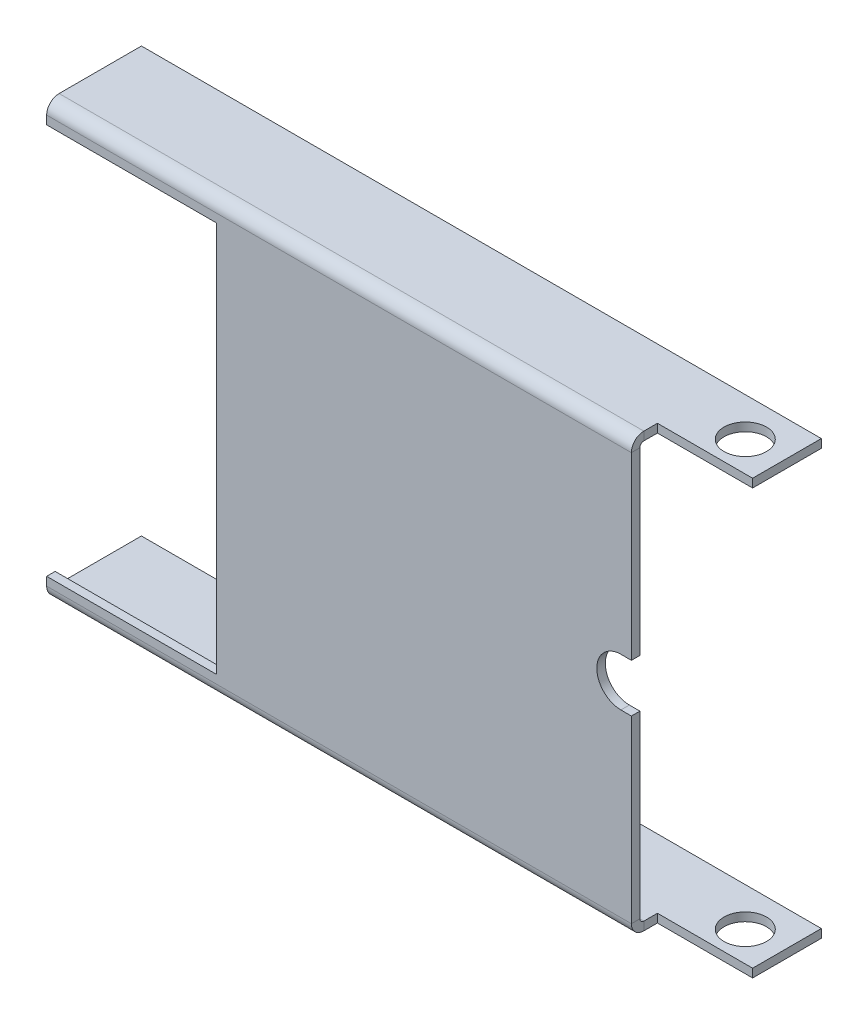
ISO-10303-21;
HEADER;
FILE_DESCRIPTION(('STEP AP214'),'2;1');
FILE_NAME('part.step','',(''),(''),'','','');
FILE_SCHEMA(('AUTOMOTIVE_DESIGN { 1 0 10303 214 1 1 1 1 }'));
ENDSEC;
DATA;
#1=APPLICATION_CONTEXT('core data for automotive mechanical design processes');
#2=APPLICATION_PROTOCOL_DEFINITION('international standard','automotive_design',2000,#1);
#3=PRODUCT_CONTEXT('',#1,'mechanical');
#4=PRODUCT('Part','Part','',(#3));
#5=PRODUCT_RELATED_PRODUCT_CATEGORY('part','',(#4));
#6=PRODUCT_DEFINITION_FORMATION('','',#4);
#7=PRODUCT_DEFINITION_CONTEXT('part definition',#1,'design');
#8=PRODUCT_DEFINITION('design','',#6,#7);
#9=PRODUCT_DEFINITION_SHAPE('','',#8);
#10=(LENGTH_UNIT() NAMED_UNIT(*) SI_UNIT(.MILLI.,.METRE.));
#11=(NAMED_UNIT(*) PLANE_ANGLE_UNIT() SI_UNIT($,.RADIAN.));
#12=(NAMED_UNIT(*) SI_UNIT($,.STERADIAN.) SOLID_ANGLE_UNIT());
#13=UNCERTAINTY_MEASURE_WITH_UNIT(LENGTH_MEASURE(1.E-05),#10,'distance_accuracy_value','');
#14=(GEOMETRIC_REPRESENTATION_CONTEXT(3) GLOBAL_UNCERTAINTY_ASSIGNED_CONTEXT((#13)) GLOBAL_UNIT_ASSIGNED_CONTEXT((#10,
#11,#12)) REPRESENTATION_CONTEXT('',''));
#15=CARTESIAN_POINT('',(0.,0.,0.));
#16=DIRECTION('',(0.,0.,1.));
#17=DIRECTION('',(1.,0.,0.));
#18=AXIS2_PLACEMENT_3D('',#15,#16,#17);
#19=CARTESIAN_POINT('',(-63.5,55.88,-1.5875));
#20=DIRECTION('',(-1.,0.,0.));
#21=DIRECTION('',(0.,-1.,0.));
#22=AXIS2_PLACEMENT_3D('',#19,#20,#21);
#23=PLANE('',#22);
#24=DIRECTION('',(0.,0.,-1.));
#25=VECTOR('',#24,1.);
#26=CARTESIAN_POINT('',(-63.5,36.5125,-1.5875));
#27=LINE('',#26,#25);
#28=CARTESIAN_POINT('',(-63.5,36.5125,0.));
#29=VERTEX_POINT('',#28);
#30=CARTESIAN_POINT('',(-63.5,36.5125,-1.5875));
#31=VERTEX_POINT('',#30);
#32=EDGE_CURVE('E12',#29,#31,#27,.T.);
#33=ORIENTED_EDGE('',*,*,#32,.F.);
#34=DIRECTION('',(0.,-1.,0.));
#35=VECTOR('',#34,1.);
#36=CARTESIAN_POINT('',(-63.5,55.88,0.));
#37=LINE('',#36,#35);
#38=CARTESIAN_POINT('',(-63.5,38.1,0.));
#39=VERTEX_POINT('',#38);
#40=EDGE_CURVE('E498',#39,#29,#37,.T.);
#41=ORIENTED_EDGE('',*,*,#40,.F.);
#42=DIRECTION('',(0.,0.,1.));
#43=VECTOR('',#42,1.);
#44=CARTESIAN_POINT('',(-63.5,38.1,-1.5875));
#45=LINE('',#44,#43);
#46=CARTESIAN_POINT('',(-63.5,38.1,-1.5875));
#47=VERTEX_POINT('',#46);
#48=EDGE_CURVE('E473',#47,#39,#45,.T.);
#49=ORIENTED_EDGE('',*,*,#48,.F.);
#50=DIRECTION('',(0.,-1.,0.));
#51=VECTOR('',#50,1.);
#52=CARTESIAN_POINT('',(-63.5,55.88,-1.5875));
#53=LINE('',#52,#51);
#54=EDGE_CURVE('E474',#47,#31,#53,.T.);
#55=ORIENTED_EDGE('',*,*,#54,.T.);
#56=EDGE_LOOP('',(#33,#41,#49,#55));
#57=FACE_BOUND('',#56,.T.);
#58=ADVANCED_FACE('F57',(#57),#23,.T.);
#59=CARTESIAN_POINT('',(0.,0.,-1.5875));
#60=DIRECTION('',(0.,0.,-1.));
#61=DIRECTION('',(-1.,0.,0.));
#62=AXIS2_PLACEMENT_3D('',#59,#60,#61);
#63=PLANE('',#62);
#64=DIRECTION('',(1.,0.,0.));
#65=VECTOR('',#64,1.);
#66=CARTESIAN_POINT('',(0.,36.5125,-1.5875));
#67=LINE('',#66,#65);
#68=CARTESIAN_POINT('',(-31.75,36.5125,-1.5875));
#69=VERTEX_POINT('',#68);
#70=EDGE_CURVE('E291',#31,#69,#67,.T.);
#71=ORIENTED_EDGE('',*,*,#70,.F.);
#72=ORIENTED_EDGE('',*,*,#54,.F.);
#73=DIRECTION('',(-1.,0.,0.));
#74=VECTOR('',#73,1.);
#75=CARTESIAN_POINT('',(0.,38.1,-1.5875));
#76=LINE('',#75,#74);
#77=CARTESIAN_POINT('',(45.72,38.1,-1.5875));
#78=VERTEX_POINT('',#77);
#79=EDGE_CURVE('E470',#78,#47,#76,.T.);
#80=ORIENTED_EDGE('',*,*,#79,.F.);
#81=DIRECTION('',(0.,1.,0.));
#82=VECTOR('',#81,1.);
#83=CARTESIAN_POINT('',(45.72,0.,-1.58749999999991));
#84=LINE('',#83,#82);
#85=CARTESIAN_POINT('',(45.72,4.5,-1.58749999999991));
#86=VERTEX_POINT('',#85);
#87=EDGE_CURVE('E354',#78,#86,#84,.F.);
#88=ORIENTED_EDGE('',*,*,#87,.T.);
#89=DIRECTION('',(-1.,0.,0.));
#90=VECTOR('',#89,1.);
#91=CARTESIAN_POINT('',(0.,4.50000000000001,-1.5875));
#92=LINE('',#91,#90);
#93=CARTESIAN_POINT('',(43.76000011,4.5,-1.5875));
#94=VERTEX_POINT('',#93);
#95=EDGE_CURVE('E81',#86,#94,#92,.T.);
#96=ORIENTED_EDGE('',*,*,#95,.T.);
#97=CARTESIAN_POINT('',(43.76000011,0.,-1.5875));
#98=DIRECTION('',(0.,0.,-1.));
#99=DIRECTION('',(-1.,0.,0.));
#100=AXIS2_PLACEMENT_3D('',#97,#98,#99);
#101=CIRCLE('',#100,4.5);
#102=CARTESIAN_POINT('',(43.76000011,-4.5,-1.5875));
#103=VERTEX_POINT('',#102);
#104=EDGE_CURVE('E321',#103,#94,#101,.T.);
#105=ORIENTED_EDGE('',*,*,#104,.F.);
#106=DIRECTION('',(1.,0.,0.));
#107=VECTOR('',#106,1.);
#108=CARTESIAN_POINT('',(0.,-4.50000000000001,-1.5875));
#109=LINE('',#108,#107);
#110=CARTESIAN_POINT('',(45.72,-4.5,-1.58749999999998));
#111=VERTEX_POINT('',#110);
#112=EDGE_CURVE('E317',#103,#111,#109,.T.);
#113=ORIENTED_EDGE('',*,*,#112,.T.);
#114=CARTESIAN_POINT('',(45.72,-38.1,-1.5875));
#115=VERTEX_POINT('',#114);
#116=EDGE_CURVE('E353',#111,#115,#84,.F.);
#117=ORIENTED_EDGE('',*,*,#116,.T.);
#118=DIRECTION('',(-1.,0.,0.));
#119=VECTOR('',#118,1.);
#120=CARTESIAN_POINT('',(0.,-38.1,-1.5875));
#121=LINE('',#120,#119);
#122=CARTESIAN_POINT('',(-63.5,-38.1,-1.5875));
#123=VERTEX_POINT('',#122);
#124=EDGE_CURVE('E481',#115,#123,#121,.T.);
#125=ORIENTED_EDGE('',*,*,#124,.T.);
#126=CARTESIAN_POINT('',(-63.5,-36.5125,-1.5875));
#127=VERTEX_POINT('',#126);
#128=EDGE_CURVE('E497',#127,#123,#53,.T.);
#129=ORIENTED_EDGE('',*,*,#128,.F.);
#130=DIRECTION('',(-1.,0.,0.));
#131=VECTOR('',#130,1.);
#132=CARTESIAN_POINT('',(0.,-36.5125,-1.5875));
#133=LINE('',#132,#131);
#134=CARTESIAN_POINT('',(-31.75,-36.5125,-1.5875));
#135=VERTEX_POINT('',#134);
#136=EDGE_CURVE('E73',#135,#127,#133,.T.);
#137=ORIENTED_EDGE('',*,*,#136,.F.);
#138=DIRECTION('',(0.,-1.,0.));
#139=VECTOR('',#138,1.);
#140=CARTESIAN_POINT('',(-31.75,0.,-1.5875));
#141=LINE('',#140,#139);
#142=EDGE_CURVE('E294',#69,#135,#141,.T.);
#143=ORIENTED_EDGE('',*,*,#142,.F.);
#144=EDGE_LOOP('',(#71,#72,#80,#88,#96,#105,#113,#117,#125,#129,#137,#143));
#145=FACE_BOUND('',#144,.T.);
#146=ADVANCED_FACE('F547',(#145),#63,.T.);
#147=CARTESIAN_POINT('',(0.,0.,0.));
#148=DIRECTION('',(0.,0.,-1.));
#149=DIRECTION('',(-1.,0.,0.));
#150=AXIS2_PLACEMENT_3D('',#147,#148,#149);
#151=PLANE('',#150);
#152=ORIENTED_EDGE('',*,*,#40,.T.);
#153=DIRECTION('',(-1.,0.,0.));
#154=VECTOR('',#153,1.);
#155=CARTESIAN_POINT('',(-63.5,36.5125,0.));
#156=LINE('',#155,#154);
#157=CARTESIAN_POINT('',(-31.75,36.5125,0.));
#158=VERTEX_POINT('',#157);
#159=EDGE_CURVE('E280',#158,#29,#156,.T.);
#160=ORIENTED_EDGE('',*,*,#159,.F.);
#161=DIRECTION('',(0.,1.,0.));
#162=VECTOR('',#161,1.);
#163=CARTESIAN_POINT('',(-31.75,36.5125,0.));
#164=LINE('',#163,#162);
#165=CARTESIAN_POINT('',(-31.75,-36.5125,0.));
#166=VERTEX_POINT('',#165);
#167=EDGE_CURVE('E276',#166,#158,#164,.T.);
#168=ORIENTED_EDGE('',*,*,#167,.F.);
#169=DIRECTION('',(1.,0.,0.));
#170=VECTOR('',#169,1.);
#171=CARTESIAN_POINT('',(-63.5,-36.5125,0.));
#172=LINE('',#171,#170);
#173=CARTESIAN_POINT('',(-63.5,-36.5125,0.));
#174=VERTEX_POINT('',#173);
#175=EDGE_CURVE('E272',#174,#166,#172,.T.);
#176=ORIENTED_EDGE('',*,*,#175,.F.);
#177=CARTESIAN_POINT('',(-63.5,-38.1,0.));
#178=VERTEX_POINT('',#177);
#179=EDGE_CURVE('E466',#174,#178,#37,.T.);
#180=ORIENTED_EDGE('',*,*,#179,.T.);
#181=DIRECTION('',(-1.,0.,0.));
#182=VECTOR('',#181,1.);
#183=CARTESIAN_POINT('',(0.,-38.1,0.));
#184=LINE('',#183,#182);
#185=CARTESIAN_POINT('',(45.72,-38.1,0.));
#186=VERTEX_POINT('',#185);
#187=EDGE_CURVE('E485',#186,#178,#184,.T.);
#188=ORIENTED_EDGE('',*,*,#187,.F.);
#189=DIRECTION('',(0.,-1.,0.));
#190=VECTOR('',#189,1.);
#191=CARTESIAN_POINT('',(45.72,-38.8366000000001,0.));
#192=LINE('',#191,#190);
#193=CARTESIAN_POINT('',(45.72,-4.5,0.));
#194=VERTEX_POINT('',#193);
#195=EDGE_CURVE('E344',#194,#186,#192,.T.);
#196=ORIENTED_EDGE('',*,*,#195,.F.);
#197=DIRECTION('',(-1.,0.,0.));
#198=VECTOR('',#197,1.);
#199=CARTESIAN_POINT('',(0.,-4.50000000000001,0.));
#200=LINE('',#199,#198);
#201=CARTESIAN_POINT('',(43.76000011,-4.5,0.));
#202=VERTEX_POINT('',#201);
#203=EDGE_CURVE('E305',#194,#202,#200,.T.);
#204=ORIENTED_EDGE('',*,*,#203,.T.);
#205=CARTESIAN_POINT('',(43.76000011,0.,0.));
#206=DIRECTION('',(0.,0.,1.));
#207=DIRECTION('',(1.,0.,0.));
#208=AXIS2_PLACEMENT_3D('',#205,#206,#207);
#209=CIRCLE('',#208,4.5);
#210=CARTESIAN_POINT('',(43.76000011,4.5,0.));
#211=VERTEX_POINT('',#210);
#212=EDGE_CURVE('E301',#211,#202,#209,.T.);
#213=ORIENTED_EDGE('',*,*,#212,.F.);
#214=DIRECTION('',(1.,0.,0.));
#215=VECTOR('',#214,1.);
#216=CARTESIAN_POINT('',(0.,4.50000000000001,0.));
#217=LINE('',#216,#215);
#218=CARTESIAN_POINT('',(45.72,4.5,0.));
#219=VERTEX_POINT('',#218);
#220=EDGE_CURVE('E297',#211,#219,#217,.T.);
#221=ORIENTED_EDGE('',*,*,#220,.T.);
#222=CARTESIAN_POINT('',(45.72,38.1,0.));
#223=VERTEX_POINT('',#222);
#224=EDGE_CURVE('E345',#223,#219,#192,.T.);
#225=ORIENTED_EDGE('',*,*,#224,.F.);
#226=DIRECTION('',(-1.,0.,0.));
#227=VECTOR('',#226,1.);
#228=CARTESIAN_POINT('',(0.,38.1,0.));
#229=LINE('',#228,#227);
#230=EDGE_CURVE('E478',#223,#39,#229,.T.);
#231=ORIENTED_EDGE('',*,*,#230,.T.);
#232=EDGE_LOOP('',(#152,#160,#168,#176,#180,#188,#196,#204,#213,#221,#225,#231));
#233=FACE_BOUND('',#232,.T.);
#234=ADVANCED_FACE('F515',(#233),#151,.F.);
#235=CARTESIAN_POINT('',(45.72,-38.8366000000001,0.));
#236=DIRECTION('',(1.,0.,0.));
#237=DIRECTION('',(0.,-1.,0.));
#238=AXIS2_PLACEMENT_3D('',#235,#236,#237);
#239=PLANE('',#238);
#240=ORIENTED_EDGE('',*,*,#116,.F.);
#241=DIRECTION('',(0.,0.,1.));
#242=VECTOR('',#241,1.);
#243=CARTESIAN_POINT('',(45.72,-4.5,0.));
#244=LINE('',#243,#242);
#245=EDGE_CURVE('E504',#111,#194,#244,.T.);
#246=ORIENTED_EDGE('',*,*,#245,.T.);
#247=ORIENTED_EDGE('',*,*,#195,.T.);
#248=DIRECTION('',(0.,0.,1.));
#249=VECTOR('',#248,1.);
#250=CARTESIAN_POINT('',(45.72,-38.1,-1.58749999999991));
#251=LINE('',#250,#249);
#252=EDGE_CURVE('E349',#115,#186,#251,.T.);
#253=ORIENTED_EDGE('',*,*,#252,.F.);
#254=EDGE_LOOP('',(#240,#246,#247,#253));
#255=FACE_BOUND('',#254,.T.);
#256=ADVANCED_FACE('F557',(#255),#239,.T.);
#257=ORIENTED_EDGE('',*,*,#224,.T.);
#258=DIRECTION('',(0.,0.,-1.));
#259=VECTOR('',#258,1.);
#260=CARTESIAN_POINT('',(45.72,4.5,0.));
#261=LINE('',#260,#259);
#262=EDGE_CURVE('E493',#219,#86,#261,.T.);
#263=ORIENTED_EDGE('',*,*,#262,.T.);
#264=ORIENTED_EDGE('',*,*,#87,.F.);
#265=DIRECTION('',(0.,0.,1.));
#266=VECTOR('',#265,1.);
#267=CARTESIAN_POINT('',(45.72,38.1,-1.58749999999991));
#268=LINE('',#267,#266);
#269=EDGE_CURVE('E340',#78,#223,#268,.T.);
#270=ORIENTED_EDGE('',*,*,#269,.T.);
#271=EDGE_LOOP('',(#257,#263,#264,#270));
#272=FACE_BOUND('',#271,.T.);
#273=ADVANCED_FACE('F569',(#272),#239,.T.);
#274=CARTESIAN_POINT('',(-127.032667996758,38.1,-2.3241));
#275=DIRECTION('',(1.,0.,0.));
#276=DIRECTION('',(0.,1.,0.));
#277=AXIS2_PLACEMENT_3D('',#274,#275,#276);
#278=CYLINDRICAL_SURFACE('',#277,0.7366);
#279=DIRECTION('',(-1.,0.,0.));
#280=VECTOR('',#279,1.);
#281=CARTESIAN_POINT('',(0.,38.8366,-2.3241));
#282=LINE('',#281,#280);
#283=CARTESIAN_POINT('',(45.7200000000001,38.8366,-2.32409999999971));
#284=VERTEX_POINT('',#283);
#285=CARTESIAN_POINT('',(-63.5,38.8366,-2.3241));
#286=VERTEX_POINT('',#285);
#287=EDGE_CURVE('E450',#284,#286,#282,.T.);
#288=ORIENTED_EDGE('',*,*,#287,.F.);
#289=CARTESIAN_POINT('',(45.72,38.1,-2.3241));
#290=DIRECTION('',(1.,0.,0.));
#291=DIRECTION('',(0.,0.,-1.));
#292=AXIS2_PLACEMENT_3D('',#289,#290,#291);
#293=CIRCLE('',#292,0.736599999999998);
#294=EDGE_CURVE('E374',#284,#78,#293,.T.);
#295=ORIENTED_EDGE('',*,*,#294,.T.);
#296=ORIENTED_EDGE('',*,*,#79,.T.);
#297=CARTESIAN_POINT('',(-63.5,38.1,-2.3241));
#298=DIRECTION('',(-1.,0.,0.));
#299=DIRECTION('',(0.,0.,-1.));
#300=AXIS2_PLACEMENT_3D('',#297,#298,#299);
#301=CIRCLE('',#300,0.736599999999998);
#302=EDGE_CURVE('E462',#47,#286,#301,.T.);
#303=ORIENTED_EDGE('',*,*,#302,.T.);
#304=EDGE_LOOP('',(#288,#295,#296,#303));
#305=FACE_BOUND('',#304,.T.);
#306=ADVANCED_FACE('F578',(#305),#278,.F.);
#307=CARTESIAN_POINT('',(-127.032667996758,38.1,-2.3241));
#308=DIRECTION('',(1.,0.,0.));
#309=DIRECTION('',(0.,1.,0.));
#310=AXIS2_PLACEMENT_3D('',#307,#308,#309);
#311=CYLINDRICAL_SURFACE('',#310,2.3241);
#312=CARTESIAN_POINT('',(45.72,38.1,-2.3241));
#313=DIRECTION('',(-1.,0.,0.));
#314=DIRECTION('',(0.,-1.,0.));
#315=AXIS2_PLACEMENT_3D('',#312,#313,#314);
#316=CIRCLE('',#315,2.3241);
#317=CARTESIAN_POINT('',(45.72,40.4241,-2.32410000000001));
#318=VERTEX_POINT('',#317);
#319=EDGE_CURVE('E371',#318,#223,#316,.F.);
#320=ORIENTED_EDGE('',*,*,#319,.F.);
#321=DIRECTION('',(-1.,0.,0.));
#322=VECTOR('',#321,1.);
#323=CARTESIAN_POINT('',(0.,40.4241,-2.32410000000001));
#324=LINE('',#323,#322);
#325=CARTESIAN_POINT('',(-63.5,40.4241,-2.3241));
#326=VERTEX_POINT('',#325);
#327=EDGE_CURVE('E419',#318,#326,#324,.T.);
#328=ORIENTED_EDGE('',*,*,#327,.T.);
#329=CARTESIAN_POINT('',(-63.5,38.1,-2.3241));
#330=DIRECTION('',(1.,0.,0.));
#331=DIRECTION('',(0.,1.,0.));
#332=AXIS2_PLACEMENT_3D('',#329,#330,#331);
#333=CIRCLE('',#332,2.3241);
#334=EDGE_CURVE('E427',#39,#326,#333,.F.);
#335=ORIENTED_EDGE('',*,*,#334,.F.);
#336=ORIENTED_EDGE('',*,*,#230,.F.);
#337=EDGE_LOOP('',(#320,#328,#335,#336));
#338=FACE_BOUND('',#337,.T.);
#339=ADVANCED_FACE('F619',(#338),#311,.T.);
#340=CARTESIAN_POINT('',(127.032667996758,-38.1000000000001,-2.3241));
#341=DIRECTION('',(-1.,0.,0.));
#342=DIRECTION('',(0.,-1.,0.));
#343=AXIS2_PLACEMENT_3D('',#340,#341,#342);
#344=CYLINDRICAL_SURFACE('',#343,0.7366);
#345=ORIENTED_EDGE('',*,*,#124,.F.);
#346=CARTESIAN_POINT('',(45.72,-38.1,-2.32409999999997));
#347=DIRECTION('',(1.,0.,0.));
#348=DIRECTION('',(0.,1.,0.));
#349=AXIS2_PLACEMENT_3D('',#346,#347,#348);
#350=CIRCLE('',#349,0.736599999999993);
#351=CARTESIAN_POINT('',(45.72,-38.8366000000001,-2.32409999999997));
#352=VERTEX_POINT('',#351);
#353=EDGE_CURVE('E363',#115,#352,#350,.T.);
#354=ORIENTED_EDGE('',*,*,#353,.T.);
#355=DIRECTION('',(-1.,0.,0.));
#356=VECTOR('',#355,1.);
#357=CARTESIAN_POINT('',(0.,-38.8366,-2.32409999999997));
#358=LINE('',#357,#356);
#359=CARTESIAN_POINT('',(-63.5,-38.8366,-2.3241));
#360=VERTEX_POINT('',#359);
#361=EDGE_CURVE('E378',#352,#360,#358,.T.);
#362=ORIENTED_EDGE('',*,*,#361,.T.);
#363=CARTESIAN_POINT('',(-63.5,-38.1,-2.3241));
#364=DIRECTION('',(-1.,0.,0.));
#365=DIRECTION('',(0.,0.,-1.));
#366=AXIS2_PLACEMENT_3D('',#363,#364,#365);
#367=CIRCLE('',#366,0.736599999999998);
#368=EDGE_CURVE('E415',#360,#123,#367,.T.);
#369=ORIENTED_EDGE('',*,*,#368,.T.);
#370=EDGE_LOOP('',(#345,#354,#362,#369));
#371=FACE_BOUND('',#370,.T.);
#372=ADVANCED_FACE('F542',(#371),#344,.F.);
#373=CARTESIAN_POINT('',(127.032667996758,-38.1000000000001,-2.3241));
#374=DIRECTION('',(-1.,0.,0.));
#375=DIRECTION('',(0.,-1.,0.));
#376=AXIS2_PLACEMENT_3D('',#373,#374,#375);
#377=CYLINDRICAL_SURFACE('',#376,2.3241);
#378=CARTESIAN_POINT('',(45.72,-38.1,-2.32409999999997));
#379=DIRECTION('',(-1.,0.,0.));
#380=DIRECTION('',(0.,-1.,0.));
#381=AXIS2_PLACEMENT_3D('',#378,#379,#380);
#382=CIRCLE('',#381,2.3241);
#383=CARTESIAN_POINT('',(45.72,-40.4241000000001,-2.32409999999998));
#384=VERTEX_POINT('',#383);
#385=EDGE_CURVE('E358',#186,#384,#382,.F.);
#386=ORIENTED_EDGE('',*,*,#385,.F.);
#387=ORIENTED_EDGE('',*,*,#187,.T.);
#388=CARTESIAN_POINT('',(-63.5,-38.1,-2.3241));
#389=DIRECTION('',(-1.,0.,0.));
#390=DIRECTION('',(0.,-1.,0.));
#391=AXIS2_PLACEMENT_3D('',#388,#389,#390);
#392=CIRCLE('',#391,2.3241);
#393=CARTESIAN_POINT('',(-63.5,-40.4241,-2.32409999999998));
#394=VERTEX_POINT('',#393);
#395=EDGE_CURVE('E383',#394,#178,#392,.T.);
#396=ORIENTED_EDGE('',*,*,#395,.F.);
#397=DIRECTION('',(-1.,0.,0.));
#398=VECTOR('',#397,1.);
#399=CARTESIAN_POINT('',(0.,-40.4241,-2.32409999999998));
#400=LINE('',#399,#398);
#401=EDGE_CURVE('E393',#384,#394,#400,.T.);
#402=ORIENTED_EDGE('',*,*,#401,.F.);
#403=EDGE_LOOP('',(#386,#387,#396,#402));
#404=FACE_BOUND('',#403,.T.);
#405=ADVANCED_FACE('F553',(#404),#377,.T.);
#406=DIRECTION('',(0.,0.,1.));
#407=VECTOR('',#406,1.);
#408=CARTESIAN_POINT('',(-63.5,-36.5125,-1.5875));
#409=LINE('',#408,#407);
#410=EDGE_CURVE('E66',#127,#174,#409,.T.);
#411=ORIENTED_EDGE('',*,*,#410,.F.);
#412=ORIENTED_EDGE('',*,*,#128,.T.);
#413=DIRECTION('',(0.,0.,1.));
#414=VECTOR('',#413,1.);
#415=CARTESIAN_POINT('',(-63.5,-38.1,-1.5875));
#416=LINE('',#415,#414);
#417=EDGE_CURVE('E489',#123,#178,#416,.T.);
#418=ORIENTED_EDGE('',*,*,#417,.T.);
#419=ORIENTED_EDGE('',*,*,#179,.F.);
#420=EDGE_LOOP('',(#411,#412,#418,#419));
#421=FACE_BOUND('',#420,.T.);
#422=ADVANCED_FACE('F59',(#421),#23,.T.);
#423=CARTESIAN_POINT('',(-63.5,38.1,-2.3241));
#424=DIRECTION('',(1.,0.,0.));
#425=DIRECTION('',(0.,0.,-1.));
#426=AXIS2_PLACEMENT_3D('',#423,#424,#425);
#427=PLANE('',#426);
#428=ORIENTED_EDGE('',*,*,#334,.T.);
#429=DIRECTION('',(0.,1.,0.));
#430=VECTOR('',#429,1.);
#431=CARTESIAN_POINT('',(-63.5,38.8366,-2.3241));
#432=LINE('',#431,#430);
#433=EDGE_CURVE('E442',#286,#326,#432,.T.);
#434=ORIENTED_EDGE('',*,*,#433,.F.);
#435=ORIENTED_EDGE('',*,*,#302,.F.);
#436=ORIENTED_EDGE('',*,*,#48,.T.);
#437=EDGE_LOOP('',(#428,#434,#435,#436));
#438=FACE_BOUND('',#437,.T.);
#439=ADVANCED_FACE('F589',(#438),#427,.F.);
#440=CARTESIAN_POINT('',(63.5,38.8365999999999,-17.7002318412894));
#441=DIRECTION('',(0.,0.,-1.));
#442=DIRECTION('',(-1.,0.,0.));
#443=AXIS2_PLACEMENT_3D('',#440,#441,#442);
#444=PLANE('',#443);
#445=DIRECTION('',(-1.,0.,0.));
#446=VECTOR('',#445,1.);
#447=CARTESIAN_POINT('',(63.5,40.4240999999999,-17.7002318412894));
#448=LINE('',#447,#446);
#449=CARTESIAN_POINT('',(63.5,40.4240999999999,-17.7002318412894));
#450=VERTEX_POINT('',#449);
#451=CARTESIAN_POINT('',(-63.5,40.4241,-17.7002318412894));
#452=VERTEX_POINT('',#451);
#453=EDGE_CURVE('E435',#450,#452,#448,.T.);
#454=ORIENTED_EDGE('',*,*,#453,.F.);
#455=DIRECTION('',(0.,1.,0.));
#456=VECTOR('',#455,1.);
#457=CARTESIAN_POINT('',(63.5,38.8365999999999,-17.7002318412894));
#458=LINE('',#457,#456);
#459=CARTESIAN_POINT('',(63.5,38.8365999999999,-17.7002318412894));
#460=VERTEX_POINT('',#459);
#461=EDGE_CURVE('E423',#460,#450,#458,.T.);
#462=ORIENTED_EDGE('',*,*,#461,.F.);
#463=DIRECTION('',(-1.,0.,0.));
#464=VECTOR('',#463,1.);
#465=CARTESIAN_POINT('',(63.5,38.8365999999999,-17.7002318412894));
#466=LINE('',#465,#464);
#467=CARTESIAN_POINT('',(-63.5,38.8366,-17.7002318412894));
#468=VERTEX_POINT('',#467);
#469=EDGE_CURVE('E456',#460,#468,#466,.T.);
#470=ORIENTED_EDGE('',*,*,#469,.T.);
#471=DIRECTION('',(0.,1.,0.));
#472=VECTOR('',#471,1.);
#473=CARTESIAN_POINT('',(-63.5,38.8366,-17.7002318412894));
#474=LINE('',#473,#472);
#475=EDGE_CURVE('E453',#468,#452,#474,.T.);
#476=ORIENTED_EDGE('',*,*,#475,.T.);
#477=EDGE_LOOP('',(#454,#462,#470,#476));
#478=FACE_BOUND('',#477,.T.);
#479=ADVANCED_FACE('F603',(#478),#444,.T.);
#480=CARTESIAN_POINT('',(0.,38.8366000000001,38.1797681587106));
#481=DIRECTION('',(0.,-1.,0.));
#482=DIRECTION('',(-1.,0.,0.));
#483=AXIS2_PLACEMENT_3D('',#480,#481,#482);
#484=PLANE('',#483);
#485=DIRECTION('',(0.,0.,-1.));
#486=VECTOR('',#485,1.);
#487=CARTESIAN_POINT('',(45.7200000000001,38.8366000000001,38.1797681587106));
#488=LINE('',#487,#486);
#489=CARTESIAN_POINT('',(45.7200000000001,38.8366,-4.86409999999971));
#490=VERTEX_POINT('',#489);
#491=EDGE_CURVE('E264',#284,#490,#488,.T.);
#492=ORIENTED_EDGE('',*,*,#491,.F.);
#493=ORIENTED_EDGE('',*,*,#287,.T.);
#494=DIRECTION('',(0.,0.,1.));
#495=VECTOR('',#494,1.);
#496=CARTESIAN_POINT('',(-63.5,38.8366,-17.7002318412894));
#497=LINE('',#496,#495);
#498=EDGE_CURVE('E446',#468,#286,#497,.T.);
#499=ORIENTED_EDGE('',*,*,#498,.F.);
#500=ORIENTED_EDGE('',*,*,#469,.F.);
#501=DIRECTION('',(0.,0.,-1.));
#502=VECTOR('',#501,1.);
#503=CARTESIAN_POINT('',(63.5,38.8365999999999,-17.7002318412894));
#504=LINE('',#503,#502);
#505=CARTESIAN_POINT('',(63.5,38.8365999999999,-4.8640999999997));
#506=VERTEX_POINT('',#505);
#507=EDGE_CURVE('E428',#506,#460,#504,.T.);
#508=ORIENTED_EDGE('',*,*,#507,.F.);
#509=DIRECTION('',(1.,0.,0.));
#510=VECTOR('',#509,1.);
#511=CARTESIAN_POINT('',(0.,38.8366,-4.8640999999997));
#512=LINE('',#511,#510);
#513=EDGE_CURVE('E269',#490,#506,#512,.T.);
#514=ORIENTED_EDGE('',*,*,#513,.F.);
#515=EDGE_LOOP('',(#492,#493,#499,#500,#508,#514));
#516=FACE_BOUND('',#515,.T.);
#517=CARTESIAN_POINT('',(56.515,38.8366,-10.4775000000001));
#518=DIRECTION('',(0.,-1.,0.));
#519=DIRECTION('',(0.,0.,-1.));
#520=AXIS2_PLACEMENT_3D('',#517,#518,#519);
#521=CIRCLE('',#520,3.96875);
#522=CARTESIAN_POINT('',(56.515,38.8366,-14.4462500000001));
#523=VERTEX_POINT('',#522);
#524=EDGE_CURVE('E336',#523,#523,#521,.T.);
#525=ORIENTED_EDGE('',*,*,#524,.F.);
#526=EDGE_LOOP('',(#525));
#527=FACE_BOUND('',#526,.T.);
#528=ADVANCED_FACE('F597',(#516,#527),#484,.T.);
#529=CARTESIAN_POINT('',(-63.5,38.8366,-17.7002318412894));
#530=DIRECTION('',(-1.,0.,0.));
#531=DIRECTION('',(0.,0.,1.));
#532=AXIS2_PLACEMENT_3D('',#529,#530,#531);
#533=PLANE('',#532);
#534=ORIENTED_EDGE('',*,*,#498,.T.);
#535=ORIENTED_EDGE('',*,*,#433,.T.);
#536=DIRECTION('',(0.,0.,1.));
#537=VECTOR('',#536,1.);
#538=CARTESIAN_POINT('',(-63.5,40.4241,-17.7002318412894));
#539=LINE('',#538,#537);
#540=EDGE_CURVE('E431',#452,#326,#539,.T.);
#541=ORIENTED_EDGE('',*,*,#540,.F.);
#542=ORIENTED_EDGE('',*,*,#475,.F.);
#543=EDGE_LOOP('',(#534,#535,#541,#542));
#544=FACE_BOUND('',#543,.T.);
#545=ADVANCED_FACE('F592',(#544),#533,.T.);
#546=CARTESIAN_POINT('',(0.,40.4241000000001,38.1797681587106));
#547=DIRECTION('',(0.,-1.,0.));
#548=DIRECTION('',(-1.,0.,0.));
#549=AXIS2_PLACEMENT_3D('',#546,#547,#548);
#550=PLANE('',#549);
#551=CARTESIAN_POINT('',(56.515,40.4241,-10.4775000000001));
#552=DIRECTION('',(0.,1.,0.));
#553=DIRECTION('',(0.,0.,1.));
#554=AXIS2_PLACEMENT_3D('',#551,#552,#553);
#555=CIRCLE('',#554,3.96875);
#556=CARTESIAN_POINT('',(56.515,40.4241,-6.50875000000006));
#557=VERTEX_POINT('',#556);
#558=EDGE_CURVE('E324',#557,#557,#555,.T.);
#559=ORIENTED_EDGE('',*,*,#558,.F.);
#560=EDGE_LOOP('',(#559));
#561=FACE_BOUND('',#560,.T.);
#562=ORIENTED_EDGE('',*,*,#327,.F.);
#563=DIRECTION('',(0.,0.,1.));
#564=VECTOR('',#563,1.);
#565=CARTESIAN_POINT('',(45.7200000000001,40.4241,-2.32409999999957));
#566=LINE('',#565,#564);
#567=CARTESIAN_POINT('',(45.72,40.4241,-4.8640999999997));
#568=VERTEX_POINT('',#567);
#569=EDGE_CURVE('E253',#568,#318,#566,.T.);
#570=ORIENTED_EDGE('',*,*,#569,.F.);
#571=DIRECTION('',(-1.,0.,0.));
#572=VECTOR('',#571,1.);
#573=CARTESIAN_POINT('',(45.7200000000001,40.4241,-4.8640999999997));
#574=LINE('',#573,#572);
#575=CARTESIAN_POINT('',(63.5,40.4241,-4.8640999999997));
#576=VERTEX_POINT('',#575);
#577=EDGE_CURVE('E258',#576,#568,#574,.T.);
#578=ORIENTED_EDGE('',*,*,#577,.F.);
#579=DIRECTION('',(0.,0.,-1.));
#580=VECTOR('',#579,1.);
#581=CARTESIAN_POINT('',(63.5,40.4240999999999,-17.7002318412894));
#582=LINE('',#581,#580);
#583=EDGE_CURVE('E439',#576,#450,#582,.T.);
#584=ORIENTED_EDGE('',*,*,#583,.T.);
#585=ORIENTED_EDGE('',*,*,#453,.T.);
#586=ORIENTED_EDGE('',*,*,#540,.T.);
#587=EDGE_LOOP('',(#562,#570,#578,#584,#585,#586));
#588=FACE_BOUND('',#587,.T.);
#589=ADVANCED_FACE('F617',(#561,#588),#550,.F.);
#590=CARTESIAN_POINT('',(63.5,38.8365999999999,-17.7002318412894));
#591=DIRECTION('',(1.,0.,0.));
#592=DIRECTION('',(0.,0.,-1.));
#593=AXIS2_PLACEMENT_3D('',#590,#591,#592);
#594=PLANE('',#593);
#595=DIRECTION('',(0.,-1.,0.));
#596=VECTOR('',#595,1.);
#597=CARTESIAN_POINT('',(63.5000000000001,58.3846122421383,-4.86409999999964));
#598=LINE('',#597,#596);
#599=EDGE_CURVE('E250',#576,#506,#598,.T.);
#600=ORIENTED_EDGE('',*,*,#599,.T.);
#601=ORIENTED_EDGE('',*,*,#507,.T.);
#602=ORIENTED_EDGE('',*,*,#461,.T.);
#603=ORIENTED_EDGE('',*,*,#583,.F.);
#604=EDGE_LOOP('',(#600,#601,#602,#603));
#605=FACE_BOUND('',#604,.T.);
#606=ADVANCED_FACE('F606',(#605),#594,.T.);
#607=CARTESIAN_POINT('',(-63.5,-38.1,-2.3241));
#608=DIRECTION('',(1.,0.,0.));
#609=DIRECTION('',(0.,0.,-1.));
#610=AXIS2_PLACEMENT_3D('',#607,#608,#609);
#611=PLANE('',#610);
#612=DIRECTION('',(0.,-1.,0.));
#613=VECTOR('',#612,1.);
#614=CARTESIAN_POINT('',(-63.5,-38.8366,-2.32409999999997));
#615=LINE('',#614,#613);
#616=EDGE_CURVE('E409',#360,#394,#615,.T.);
#617=ORIENTED_EDGE('',*,*,#616,.T.);
#618=ORIENTED_EDGE('',*,*,#395,.T.);
#619=ORIENTED_EDGE('',*,*,#417,.F.);
#620=ORIENTED_EDGE('',*,*,#368,.F.);
#621=EDGE_LOOP('',(#617,#618,#619,#620));
#622=FACE_BOUND('',#621,.T.);
#623=ADVANCED_FACE('F550',(#622),#611,.F.);
#624=CARTESIAN_POINT('',(63.5,-38.8366,-17.7002318412893));
#625=DIRECTION('',(0.,0.,-1.));
#626=DIRECTION('',(1.,0.,0.));
#627=AXIS2_PLACEMENT_3D('',#624,#625,#626);
#628=PLANE('',#627);
#629=DIRECTION('',(1.,0.,0.));
#630=VECTOR('',#629,1.);
#631=CARTESIAN_POINT('',(63.5,-40.4241,-17.7002318412894));
#632=LINE('',#631,#630);
#633=CARTESIAN_POINT('',(-63.5,-40.4240999999999,-17.7002318412894));
#634=VERTEX_POINT('',#633);
#635=CARTESIAN_POINT('',(63.5,-40.4241,-17.7002318412894));
#636=VERTEX_POINT('',#635);
#637=EDGE_CURVE('E387',#634,#636,#632,.T.);
#638=ORIENTED_EDGE('',*,*,#637,.F.);
#639=DIRECTION('',(0.,-1.,0.));
#640=VECTOR('',#639,1.);
#641=CARTESIAN_POINT('',(-63.5,-38.8365999999999,-17.7002318412894));
#642=LINE('',#641,#640);
#643=CARTESIAN_POINT('',(-63.5,-38.8365999999999,-17.7002318412894));
#644=VERTEX_POINT('',#643);
#645=EDGE_CURVE('E379',#644,#634,#642,.T.);
#646=ORIENTED_EDGE('',*,*,#645,.F.);
#647=DIRECTION('',(1.,0.,0.));
#648=VECTOR('',#647,1.);
#649=CARTESIAN_POINT('',(63.5,-38.8366,-17.7002318412893));
#650=LINE('',#649,#648);
#651=CARTESIAN_POINT('',(63.5,-38.8366,-17.7002318412893));
#652=VERTEX_POINT('',#651);
#653=EDGE_CURVE('E405',#644,#652,#650,.T.);
#654=ORIENTED_EDGE('',*,*,#653,.T.);
#655=DIRECTION('',(0.,-1.,0.));
#656=VECTOR('',#655,1.);
#657=CARTESIAN_POINT('',(63.5,-38.8366,-17.7002318412893));
#658=LINE('',#657,#656);
#659=EDGE_CURVE('E402',#652,#636,#658,.T.);
#660=ORIENTED_EDGE('',*,*,#659,.T.);
#661=EDGE_LOOP('',(#638,#646,#654,#660));
#662=FACE_BOUND('',#661,.T.);
#663=ADVANCED_FACE('F656',(#662),#628,.T.);
#664=CARTESIAN_POINT('',(0.,-38.8366000000002,38.1797681587106));
#665=DIRECTION('',(0.,1.,0.));
#666=DIRECTION('',(-1.,0.,0.));
#667=AXIS2_PLACEMENT_3D('',#664,#665,#666);
#668=PLANE('',#667);
#669=DIRECTION('',(0.,0.,1.));
#670=VECTOR('',#669,1.);
#671=CARTESIAN_POINT('',(45.72,-38.8366000000002,38.1797681587106));
#672=LINE('',#671,#670);
#673=CARTESIAN_POINT('',(45.72,-38.8366000000001,-4.86409999999998));
#674=VERTEX_POINT('',#673);
#675=EDGE_CURVE('E261',#674,#352,#672,.T.);
#676=ORIENTED_EDGE('',*,*,#675,.F.);
#677=DIRECTION('',(-1.,0.,0.));
#678=VECTOR('',#677,1.);
#679=CARTESIAN_POINT('',(0.,-38.8366,-4.86409999999998));
#680=LINE('',#679,#678);
#681=CARTESIAN_POINT('',(63.5,-38.8366,-4.86409999999998));
#682=VERTEX_POINT('',#681);
#683=EDGE_CURVE('E226',#682,#674,#680,.T.);
#684=ORIENTED_EDGE('',*,*,#683,.F.);
#685=DIRECTION('',(0.,0.,1.));
#686=VECTOR('',#685,1.);
#687=CARTESIAN_POINT('',(63.5,-38.8366000000004,94.0597681587106));
#688=LINE('',#687,#686);
#689=EDGE_CURVE('E398',#652,#682,#688,.T.);
#690=ORIENTED_EDGE('',*,*,#689,.F.);
#691=ORIENTED_EDGE('',*,*,#653,.F.);
#692=DIRECTION('',(0.,0.,-1.));
#693=VECTOR('',#692,1.);
#694=CARTESIAN_POINT('',(-63.5,-38.8366000000003,94.0597681587106));
#695=LINE('',#694,#693);
#696=EDGE_CURVE('E384',#360,#644,#695,.T.);
#697=ORIENTED_EDGE('',*,*,#696,.F.);
#698=ORIENTED_EDGE('',*,*,#361,.F.);
#699=EDGE_LOOP('',(#676,#684,#690,#691,#697,#698));
#700=FACE_BOUND('',#699,.T.);
#701=CARTESIAN_POINT('',(56.515,-38.8366,-10.4774999999998));
#702=DIRECTION('',(0.,1.,0.));
#703=DIRECTION('',(0.,0.,1.));
#704=AXIS2_PLACEMENT_3D('',#701,#702,#703);
#705=CIRCLE('',#704,3.96875);
#706=CARTESIAN_POINT('',(56.515,-38.8366,-6.50874999999978));
#707=VERTEX_POINT('',#706);
#708=EDGE_CURVE('E332',#707,#707,#705,.T.);
#709=ORIENTED_EDGE('',*,*,#708,.F.);
#710=EDGE_LOOP('',(#709));
#711=FACE_BOUND('',#710,.T.);
#712=ADVANCED_FACE('F529',(#700,#711),#668,.T.);
#713=CARTESIAN_POINT('',(63.5,-38.8366000000004,94.0597681587106));
#714=DIRECTION('',(1.,0.,0.));
#715=DIRECTION('',(0.,0.,1.));
#716=AXIS2_PLACEMENT_3D('',#713,#714,#715);
#717=PLANE('',#716);
#718=CARTESIAN_POINT('',(63.5,-40.4241000000001,-4.86409999999998));
#719=VERTEX_POINT('',#718);
#720=EDGE_CURVE('E254',#682,#719,#598,.T.);
#721=ORIENTED_EDGE('',*,*,#720,.T.);
#722=DIRECTION('',(0.,0.,1.));
#723=VECTOR('',#722,1.);
#724=CARTESIAN_POINT('',(63.5,-40.4241000000004,94.0597681587106));
#725=LINE('',#724,#723);
#726=EDGE_CURVE('E245',#636,#719,#725,.T.);
#727=ORIENTED_EDGE('',*,*,#726,.F.);
#728=ORIENTED_EDGE('',*,*,#659,.F.);
#729=ORIENTED_EDGE('',*,*,#689,.T.);
#730=EDGE_LOOP('',(#721,#727,#728,#729));
#731=FACE_BOUND('',#730,.T.);
#732=ADVANCED_FACE('F526',(#731),#717,.T.);
#733=CARTESIAN_POINT('',(0.,-40.4241000000002,38.1797681587106));
#734=DIRECTION('',(0.,1.,0.));
#735=DIRECTION('',(-1.,0.,0.));
#736=AXIS2_PLACEMENT_3D('',#733,#734,#735);
#737=PLANE('',#736);
#738=CARTESIAN_POINT('',(56.515,-40.4241,-10.4774999999998));
#739=DIRECTION('',(0.,1.,0.));
#740=DIRECTION('',(0.,0.,1.));
#741=AXIS2_PLACEMENT_3D('',#738,#739,#740);
#742=CIRCLE('',#741,3.96875);
#743=CARTESIAN_POINT('',(56.515,-40.4241,-6.50874999999977));
#744=VERTEX_POINT('',#743);
#745=EDGE_CURVE('E328',#744,#744,#742,.F.);
#746=ORIENTED_EDGE('',*,*,#745,.F.);
#747=EDGE_LOOP('',(#746));
#748=FACE_BOUND('',#747,.T.);
#749=DIRECTION('',(1.,0.,0.));
#750=VECTOR('',#749,1.);
#751=CARTESIAN_POINT('',(45.72,-40.4241,-4.86409999999998));
#752=LINE('',#751,#750);
#753=CARTESIAN_POINT('',(45.72,-40.4241,-4.86409999999998));
#754=VERTEX_POINT('',#753);
#755=EDGE_CURVE('E223',#754,#719,#752,.T.);
#756=ORIENTED_EDGE('',*,*,#755,.F.);
#757=DIRECTION('',(0.,0.,-1.));
#758=VECTOR('',#757,1.);
#759=CARTESIAN_POINT('',(45.72,-40.4241000000001,-2.32409999999998));
#760=LINE('',#759,#758);
#761=EDGE_CURVE('E233',#384,#754,#760,.T.);
#762=ORIENTED_EDGE('',*,*,#761,.F.);
#763=ORIENTED_EDGE('',*,*,#401,.T.);
#764=DIRECTION('',(0.,0.,-1.));
#765=VECTOR('',#764,1.);
#766=CARTESIAN_POINT('',(-63.5,-40.4241000000003,94.0597681587106));
#767=LINE('',#766,#765);
#768=EDGE_CURVE('E390',#394,#634,#767,.T.);
#769=ORIENTED_EDGE('',*,*,#768,.T.);
#770=ORIENTED_EDGE('',*,*,#637,.T.);
#771=ORIENTED_EDGE('',*,*,#726,.T.);
#772=EDGE_LOOP('',(#756,#762,#763,#769,#770,#771));
#773=FACE_BOUND('',#772,.T.);
#774=ADVANCED_FACE('F242',(#748,#773),#737,.F.);
#775=CARTESIAN_POINT('',(-63.5,-38.8366000000003,94.0597681587106));
#776=DIRECTION('',(-1.,0.,0.));
#777=DIRECTION('',(0.,0.,-1.));
#778=AXIS2_PLACEMENT_3D('',#775,#776,#777);
#779=PLANE('',#778);
#780=ORIENTED_EDGE('',*,*,#616,.F.);
#781=ORIENTED_EDGE('',*,*,#696,.T.);
#782=ORIENTED_EDGE('',*,*,#645,.T.);
#783=ORIENTED_EDGE('',*,*,#768,.F.);
#784=EDGE_LOOP('',(#780,#781,#782,#783));
#785=FACE_BOUND('',#784,.T.);
#786=ADVANCED_FACE('F686',(#785),#779,.T.);
#787=CARTESIAN_POINT('',(45.72,38.1,-2.3241));
#788=DIRECTION('',(-1.,0.,0.));
#789=DIRECTION('',(0.,0.,1.));
#790=AXIS2_PLACEMENT_3D('',#787,#788,#789);
#791=PLANE('',#790);
#792=DIRECTION('',(0.,1.,0.));
#793=VECTOR('',#792,1.);
#794=CARTESIAN_POINT('',(45.72,38.8366000000001,-2.3241));
#795=LINE('',#794,#793);
#796=EDGE_CURVE('E367',#284,#318,#795,.T.);
#797=ORIENTED_EDGE('',*,*,#796,.T.);
#798=ORIENTED_EDGE('',*,*,#319,.T.);
#799=ORIENTED_EDGE('',*,*,#269,.F.);
#800=ORIENTED_EDGE('',*,*,#294,.F.);
#801=EDGE_LOOP('',(#797,#798,#799,#800));
#802=FACE_BOUND('',#801,.T.);
#803=ADVANCED_FACE('F573',(#802),#791,.F.);
#804=CARTESIAN_POINT('',(45.72,-38.1,-2.32409999999997));
#805=DIRECTION('',(-1.,0.,0.));
#806=DIRECTION('',(0.,-1.,0.));
#807=AXIS2_PLACEMENT_3D('',#804,#805,#806);
#808=PLANE('',#807);
#809=ORIENTED_EDGE('',*,*,#252,.T.);
#810=ORIENTED_EDGE('',*,*,#385,.T.);
#811=DIRECTION('',(0.,-1.,1.18929589379343E-13));
#812=VECTOR('',#811,1.);
#813=CARTESIAN_POINT('',(45.72,-38.8366000000002,-2.32409999999994));
#814=LINE('',#813,#812);
#815=EDGE_CURVE('E236',#352,#384,#814,.T.);
#816=ORIENTED_EDGE('',*,*,#815,.F.);
#817=ORIENTED_EDGE('',*,*,#353,.F.);
#818=EDGE_LOOP('',(#809,#810,#816,#817));
#819=FACE_BOUND('',#818,.T.);
#820=ADVANCED_FACE('F536',(#819),#808,.F.);
#821=CARTESIAN_POINT('',(56.515,-51.6494201513365,-10.4774999999997));
#822=DIRECTION('',(0.,1.,0.));
#823=DIRECTION('',(0.,0.,1.));
#824=AXIS2_PLACEMENT_3D('',#821,#822,#823);
#825=CYLINDRICAL_SURFACE('',#824,3.96875);
#826=ORIENTED_EDGE('',*,*,#708,.T.);
#827=EDGE_LOOP('',(#826));
#828=FACE_BOUND('',#827,.T.);
#829=ORIENTED_EDGE('',*,*,#745,.T.);
#830=EDGE_LOOP('',(#829));
#831=FACE_BOUND('',#830,.T.);
#832=ADVANCED_FACE('F680',(#828,#831),#825,.F.);
#833=ORIENTED_EDGE('',*,*,#524,.T.);
#834=EDGE_LOOP('',(#833));
#835=FACE_BOUND('',#834,.T.);
#836=ORIENTED_EDGE('',*,*,#558,.T.);
#837=EDGE_LOOP('',(#836));
#838=FACE_BOUND('',#837,.T.);
#839=ADVANCED_FACE('F713',(#835,#838),#825,.F.);
#840=CARTESIAN_POINT('',(0.,-4.50000000000001,-17.7002318412894));
#841=DIRECTION('',(0.,1.,0.));
#842=DIRECTION('',(-1.,0.,0.));
#843=AXIS2_PLACEMENT_3D('',#840,#841,#842);
#844=PLANE('',#843);
#845=DIRECTION('',(0.,0.,1.));
#846=VECTOR('',#845,1.);
#847=CARTESIAN_POINT('',(43.76000011,-4.5,-17.7002318412894));
#848=LINE('',#847,#846);
#849=EDGE_CURVE('E310',#103,#202,#848,.T.);
#850=ORIENTED_EDGE('',*,*,#849,.T.);
#851=ORIENTED_EDGE('',*,*,#203,.F.);
#852=ORIENTED_EDGE('',*,*,#245,.F.);
#853=ORIENTED_EDGE('',*,*,#112,.F.);
#854=EDGE_LOOP('',(#850,#851,#852,#853));
#855=FACE_BOUND('',#854,.T.);
#856=ADVANCED_FACE('F559',(#855),#844,.T.);
#857=CARTESIAN_POINT('',(43.76000011,0.,-17.7002318412894));
#858=DIRECTION('',(0.,0.,1.));
#859=DIRECTION('',(1.,0.,0.));
#860=AXIS2_PLACEMENT_3D('',#857,#858,#859);
#861=CYLINDRICAL_SURFACE('',#860,4.5);
#862=ORIENTED_EDGE('',*,*,#104,.T.);
#863=DIRECTION('',(0.,0.,1.));
#864=VECTOR('',#863,1.);
#865=CARTESIAN_POINT('',(43.76000011,4.5,-17.7002318412894));
#866=LINE('',#865,#864);
#867=EDGE_CURVE('E309',#94,#211,#866,.T.);
#868=ORIENTED_EDGE('',*,*,#867,.T.);
#869=ORIENTED_EDGE('',*,*,#212,.T.);
#870=ORIENTED_EDGE('',*,*,#849,.F.);
#871=EDGE_LOOP('',(#862,#868,#869,#870));
#872=FACE_BOUND('',#871,.T.);
#873=ADVANCED_FACE('F563',(#872),#861,.F.);
#874=CARTESIAN_POINT('',(0.,4.50000000000001,-17.7002318412894));
#875=DIRECTION('',(0.,-1.,0.));
#876=DIRECTION('',(1.,0.,0.));
#877=AXIS2_PLACEMENT_3D('',#874,#875,#876);
#878=PLANE('',#877);
#879=ORIENTED_EDGE('',*,*,#262,.F.);
#880=ORIENTED_EDGE('',*,*,#220,.F.);
#881=ORIENTED_EDGE('',*,*,#867,.F.);
#882=ORIENTED_EDGE('',*,*,#95,.F.);
#883=EDGE_LOOP('',(#879,#880,#881,#882));
#884=FACE_BOUND('',#883,.T.);
#885=ADVANCED_FACE('F565',(#884),#878,.T.);
#886=CARTESIAN_POINT('',(-63.5,36.5125,-2.54));
#887=DIRECTION('',(0.,1.,0.));
#888=DIRECTION('',(0.,0.,1.));
#889=AXIS2_PLACEMENT_3D('',#886,#887,#888);
#890=PLANE('',#889);
#891=ORIENTED_EDGE('',*,*,#70,.T.);
#892=DIRECTION('',(0.,0.,1.));
#893=VECTOR('',#892,1.);
#894=CARTESIAN_POINT('',(-31.75,36.5125,-2.54));
#895=LINE('',#894,#893);
#896=EDGE_CURVE('E284',#69,#158,#895,.T.);
#897=ORIENTED_EDGE('',*,*,#896,.T.);
#898=ORIENTED_EDGE('',*,*,#159,.T.);
#899=ORIENTED_EDGE('',*,*,#32,.T.);
#900=EDGE_LOOP('',(#891,#897,#898,#899));
#901=FACE_BOUND('',#900,.T.);
#902=ADVANCED_FACE('F621',(#901),#890,.F.);
#903=CARTESIAN_POINT('',(-31.75,36.5125,-2.54));
#904=DIRECTION('',(1.,0.,0.));
#905=DIRECTION('',(0.,0.,-1.));
#906=AXIS2_PLACEMENT_3D('',#903,#904,#905);
#907=PLANE('',#906);
#908=ORIENTED_EDGE('',*,*,#142,.T.);
#909=DIRECTION('',(0.,0.,1.));
#910=VECTOR('',#909,1.);
#911=CARTESIAN_POINT('',(-31.75,-36.5125,-2.54));
#912=LINE('',#911,#910);
#913=EDGE_CURVE('E283',#135,#166,#912,.T.);
#914=ORIENTED_EDGE('',*,*,#913,.T.);
#915=ORIENTED_EDGE('',*,*,#167,.T.);
#916=ORIENTED_EDGE('',*,*,#896,.F.);
#917=EDGE_LOOP('',(#908,#914,#915,#916));
#918=FACE_BOUND('',#917,.T.);
#919=ADVANCED_FACE('F624',(#918),#907,.F.);
#920=CARTESIAN_POINT('',(-63.5,-36.5125,-2.54));
#921=DIRECTION('',(0.,-1.,0.));
#922=DIRECTION('',(1.,0.,0.));
#923=AXIS2_PLACEMENT_3D('',#920,#921,#922);
#924=PLANE('',#923);
#925=ORIENTED_EDGE('',*,*,#136,.T.);
#926=ORIENTED_EDGE('',*,*,#410,.T.);
#927=ORIENTED_EDGE('',*,*,#175,.T.);
#928=ORIENTED_EDGE('',*,*,#913,.F.);
#929=EDGE_LOOP('',(#925,#926,#927,#928));
#930=FACE_BOUND('',#929,.T.);
#931=ADVANCED_FACE('F509',(#930),#924,.F.);
#932=CARTESIAN_POINT('',(45.7200000000001,58.3846122421383,-2.32409999999964));
#933=DIRECTION('',(-1.,0.,0.));
#934=DIRECTION('',(0.,-1.,0.));
#935=AXIS2_PLACEMENT_3D('',#932,#933,#934);
#936=PLANE('',#935);
#937=ORIENTED_EDGE('',*,*,#675,.T.);
#938=ORIENTED_EDGE('',*,*,#815,.T.);
#939=ORIENTED_EDGE('',*,*,#761,.T.);
#940=DIRECTION('',(0.,-1.,0.));
#941=VECTOR('',#940,1.);
#942=CARTESIAN_POINT('',(45.7200000000001,58.3846122421383,-4.86409999999964));
#943=LINE('',#942,#941);
#944=EDGE_CURVE('E219',#674,#754,#943,.T.);
#945=ORIENTED_EDGE('',*,*,#944,.F.);
#946=EDGE_LOOP('',(#937,#938,#939,#945));
#947=FACE_BOUND('',#946,.T.);
#948=ADVANCED_FACE('F234',(#947),#936,.F.);
#949=CARTESIAN_POINT('',(45.7200000000001,58.3846122421383,-4.86409999999964));
#950=DIRECTION('',(0.,0.,-1.));
#951=DIRECTION('',(0.,1.,0.));
#952=AXIS2_PLACEMENT_3D('',#949,#950,#951);
#953=PLANE('',#952);
#954=ORIENTED_EDGE('',*,*,#683,.T.);
#955=ORIENTED_EDGE('',*,*,#944,.T.);
#956=ORIENTED_EDGE('',*,*,#755,.T.);
#957=ORIENTED_EDGE('',*,*,#720,.F.);
#958=EDGE_LOOP('',(#954,#955,#956,#957));
#959=FACE_BOUND('',#958,.T.);
#960=ADVANCED_FACE('F221',(#959),#953,.F.);
#961=ORIENTED_EDGE('',*,*,#513,.T.);
#962=ORIENTED_EDGE('',*,*,#599,.F.);
#963=ORIENTED_EDGE('',*,*,#577,.T.);
#964=EDGE_CURVE('E230',#568,#490,#943,.T.);
#965=ORIENTED_EDGE('',*,*,#964,.T.);
#966=EDGE_LOOP('',(#961,#962,#963,#965));
#967=FACE_BOUND('',#966,.T.);
#968=ADVANCED_FACE('F609',(#967),#953,.F.);
#969=ORIENTED_EDGE('',*,*,#491,.T.);
#970=ORIENTED_EDGE('',*,*,#964,.F.);
#971=ORIENTED_EDGE('',*,*,#569,.T.);
#972=ORIENTED_EDGE('',*,*,#796,.F.);
#973=EDGE_LOOP('',(#969,#970,#971,#972));
#974=FACE_BOUND('',#973,.T.);
#975=ADVANCED_FACE('F614',(#974),#936,.F.);
#976=CLOSED_SHELL('',(#58,#146,#234,#256,#273,#306,#339,#372,#405,#422,#439,#479,#528,#545,#589,
#606,#623,#663,#712,#732,#774,#786,#803,#820,#832,#839,#856,#873,#885,#902,#919,#931,#948,#960,
#968,#975));
#977=MANIFOLD_SOLID_BREP('B2',#976);
#978=ADVANCED_BREP_SHAPE_REPRESENTATION('',(#18,#977),#14);
#979=SHAPE_DEFINITION_REPRESENTATION(#9,#978);
ENDSEC;
END-ISO-10303-21;
